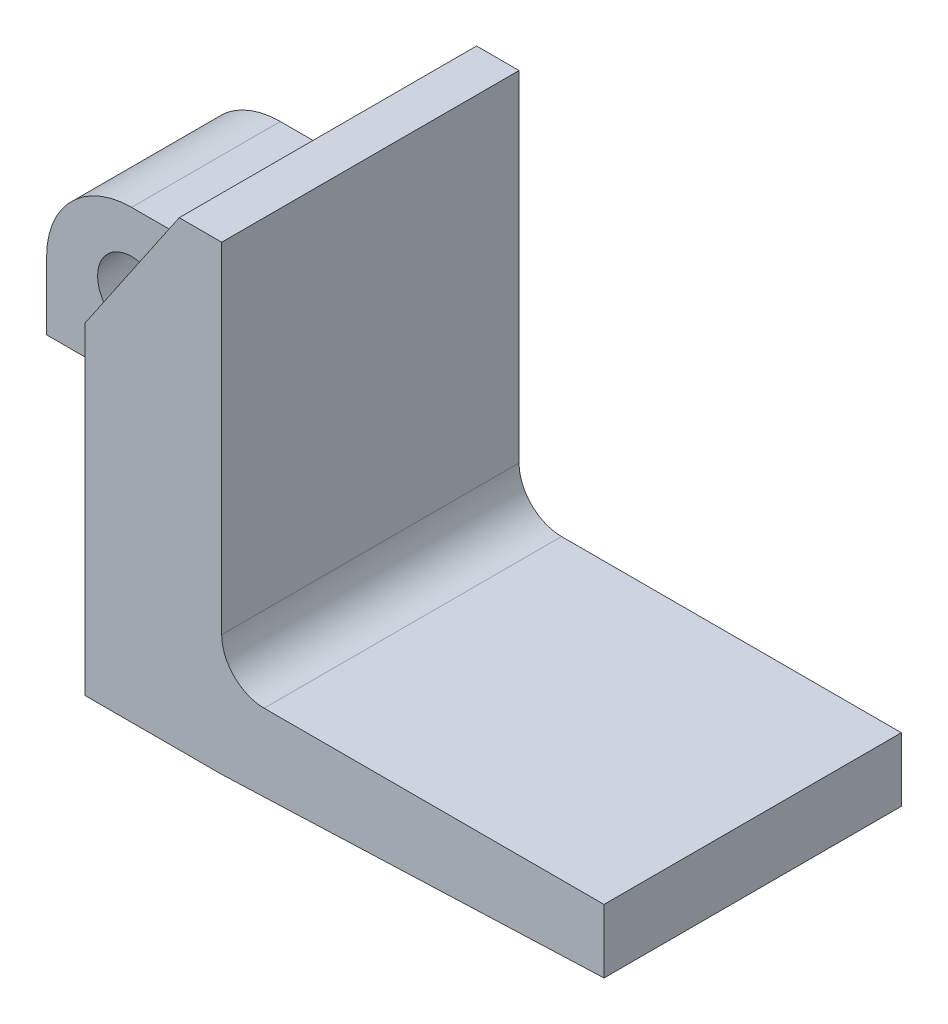
ISO-10303-21;
HEADER;
FILE_DESCRIPTION(('STEP AP214'),'2;1');
FILE_NAME('part.step','',(''),(''),'','','');
FILE_SCHEMA(('AUTOMOTIVE_DESIGN { 1 0 10303 214 1 1 1 1 }'));
ENDSEC;
DATA;
#1=APPLICATION_CONTEXT('core data for automotive mechanical design processes');
#2=APPLICATION_PROTOCOL_DEFINITION('international standard','automotive_design',2000,#1);
#3=PRODUCT_CONTEXT('',#1,'mechanical');
#4=PRODUCT('Part','Part','',(#3));
#5=PRODUCT_RELATED_PRODUCT_CATEGORY('part','',(#4));
#6=PRODUCT_DEFINITION_FORMATION('','',#4);
#7=PRODUCT_DEFINITION_CONTEXT('part definition',#1,'design');
#8=PRODUCT_DEFINITION('design','',#6,#7);
#9=PRODUCT_DEFINITION_SHAPE('','',#8);
#10=(LENGTH_UNIT() NAMED_UNIT(*) SI_UNIT(.MILLI.,.METRE.));
#11=(NAMED_UNIT(*) PLANE_ANGLE_UNIT() SI_UNIT($,.RADIAN.));
#12=(NAMED_UNIT(*) SI_UNIT($,.STERADIAN.) SOLID_ANGLE_UNIT());
#13=UNCERTAINTY_MEASURE_WITH_UNIT(LENGTH_MEASURE(1.E-05),#10,'distance_accuracy_value','');
#14=(GEOMETRIC_REPRESENTATION_CONTEXT(3) GLOBAL_UNCERTAINTY_ASSIGNED_CONTEXT((#13)) GLOBAL_UNIT_ASSIGNED_CONTEXT((#10,
#11,#12)) REPRESENTATION_CONTEXT('',''));
#15=CARTESIAN_POINT('',(0.,0.,0.));
#16=DIRECTION('',(0.,0.,1.));
#17=DIRECTION('',(1.,0.,0.));
#18=AXIS2_PLACEMENT_3D('',#15,#16,#17);
#19=CARTESIAN_POINT('',(-35.6902,32.7054976,44.45));
#20=DIRECTION('',(0.,-1.,0.));
#21=DIRECTION('',(1.,0.,0.));
#22=AXIS2_PLACEMENT_3D('',#19,#20,#21);
#23=PLANE('',#22);
#24=DIRECTION('',(-1.,0.,0.));
#25=VECTOR('',#24,1.);
#26=CARTESIAN_POINT('',(-22.9902,32.7054976,22.225));
#27=LINE('',#26,#25);
#28=CARTESIAN_POINT('',(-24.333799736365,32.7054976,22.225));
#29=VERTEX_POINT('',#28);
#30=CARTESIAN_POINT('',(-35.6902,32.7054976,22.225));
#31=VERTEX_POINT('',#30);
#32=EDGE_CURVE('E213',#29,#31,#27,.T.);
#33=ORIENTED_EDGE('',*,*,#32,.F.);
#34=DIRECTION('',(0.,0.,-1.));
#35=VECTOR('',#34,1.);
#36=CARTESIAN_POINT('',(-24.333799736365,32.7054976,0.));
#37=LINE('',#36,#35);
#38=CARTESIAN_POINT('',(-24.333799736365,32.7054976,0.));
#39=VERTEX_POINT('',#38);
#40=EDGE_CURVE('E204',#29,#39,#37,.T.);
#41=ORIENTED_EDGE('',*,*,#40,.T.);
#42=DIRECTION('',(-1.,0.,0.));
#43=VECTOR('',#42,1.);
#44=CARTESIAN_POINT('',(-35.6902,32.7054976,0.));
#45=LINE('',#44,#43);
#46=CARTESIAN_POINT('',(-35.6902,32.7054976,0.));
#47=VERTEX_POINT('',#46);
#48=EDGE_CURVE('E212',#39,#47,#45,.T.);
#49=ORIENTED_EDGE('',*,*,#48,.T.);
#50=DIRECTION('',(0.,0.,-1.));
#51=VECTOR('',#50,1.);
#52=CARTESIAN_POINT('',(-35.6902,32.7054976,44.45));
#53=LINE('',#52,#51);
#54=EDGE_CURVE('E181',#31,#47,#53,.T.);
#55=ORIENTED_EDGE('',*,*,#54,.F.);
#56=EDGE_LOOP('',(#33,#41,#49,#55));
#57=FACE_BOUND('',#56,.T.);
#58=ADVANCED_FACE('F47',(#57),#23,.F.);
#59=CARTESIAN_POINT('',(-35.6902,20.0054976,44.45));
#60=DIRECTION('',(0.,0.,-1.));
#61=DIRECTION('',(-1.,0.,0.));
#62=AXIS2_PLACEMENT_3D('',#59,#60,#61);
#63=CYLINDRICAL_SURFACE('',#62,12.7);
#64=CARTESIAN_POINT('',(-35.6902,20.0054976,22.225));
#65=DIRECTION('',(0.,0.,1.));
#66=DIRECTION('',(1.,0.,0.));
#67=AXIS2_PLACEMENT_3D('',#64,#65,#66);
#68=CIRCLE('',#67,12.7);
#69=CARTESIAN_POINT('',(-48.3902,20.0054976,22.225));
#70=VERTEX_POINT('',#69);
#71=EDGE_CURVE('E162',#31,#70,#68,.T.);
#72=ORIENTED_EDGE('',*,*,#71,.F.);
#73=ORIENTED_EDGE('',*,*,#54,.T.);
#74=CARTESIAN_POINT('',(-35.6902,20.0054976,0.));
#75=DIRECTION('',(0.,0.,1.));
#76=DIRECTION('',(1.,0.,0.));
#77=AXIS2_PLACEMENT_3D('',#74,#75,#76);
#78=CIRCLE('',#77,12.7);
#79=CARTESIAN_POINT('',(-48.3902,20.0054976,0.));
#80=VERTEX_POINT('',#79);
#81=EDGE_CURVE('E220',#47,#80,#78,.T.);
#82=ORIENTED_EDGE('',*,*,#81,.T.);
#83=DIRECTION('',(0.,0.,-1.));
#84=VECTOR('',#83,1.);
#85=CARTESIAN_POINT('',(-48.3902,20.0054976,44.45));
#86=LINE('',#85,#84);
#87=EDGE_CURVE('E179',#70,#80,#86,.T.);
#88=ORIENTED_EDGE('',*,*,#87,.F.);
#89=EDGE_LOOP('',(#72,#73,#82,#88));
#90=FACE_BOUND('',#89,.T.);
#91=ADVANCED_FACE('F333',(#90),#63,.T.);
#92=CARTESIAN_POINT('',(-48.3902,9.8454976,44.45));
#93=DIRECTION('',(1.,0.,0.));
#94=DIRECTION('',(0.,1.,0.));
#95=AXIS2_PLACEMENT_3D('',#92,#93,#94);
#96=PLANE('',#95);
#97=DIRECTION('',(0.,-1.,0.));
#98=VECTOR('',#97,1.);
#99=CARTESIAN_POINT('',(-48.3902,20.0054976,22.225));
#100=LINE('',#99,#98);
#101=CARTESIAN_POINT('',(-48.3902,9.8454976,22.225));
#102=VERTEX_POINT('',#101);
#103=EDGE_CURVE('E155',#70,#102,#100,.T.);
#104=ORIENTED_EDGE('',*,*,#103,.F.);
#105=ORIENTED_EDGE('',*,*,#87,.T.);
#106=DIRECTION('',(0.,-1.,0.));
#107=VECTOR('',#106,1.);
#108=CARTESIAN_POINT('',(-48.3902,9.8454976,0.));
#109=LINE('',#108,#107);
#110=CARTESIAN_POINT('',(-48.3902,9.8454976,0.));
#111=VERTEX_POINT('',#110);
#112=EDGE_CURVE('E177',#80,#111,#109,.T.);
#113=ORIENTED_EDGE('',*,*,#112,.T.);
#114=DIRECTION('',(0.,0.,-1.));
#115=VECTOR('',#114,1.);
#116=CARTESIAN_POINT('',(-48.3902,9.8454976,44.45));
#117=LINE('',#116,#115);
#118=EDGE_CURVE('E170',#102,#111,#117,.T.);
#119=ORIENTED_EDGE('',*,*,#118,.F.);
#120=EDGE_LOOP('',(#104,#105,#113,#119));
#121=FACE_BOUND('',#120,.T.);
#122=ADVANCED_FACE('F175',(#121),#96,.F.);
#123=CARTESIAN_POINT('',(-20.4502,9.84549760000001,44.45));
#124=DIRECTION('',(0.,1.,0.));
#125=DIRECTION('',(-1.,0.,0.));
#126=AXIS2_PLACEMENT_3D('',#123,#124,#125);
#127=PLANE('',#126);
#128=DIRECTION('',(1.,0.,0.));
#129=VECTOR('',#128,1.);
#130=CARTESIAN_POINT('',(-48.3902,9.8454976,22.225));
#131=LINE('',#130,#129);
#132=CARTESIAN_POINT('',(-20.4502,9.84549760000001,22.225));
#133=VERTEX_POINT('',#132);
#134=EDGE_CURVE('E159',#102,#133,#131,.T.);
#135=ORIENTED_EDGE('',*,*,#134,.F.);
#136=ORIENTED_EDGE('',*,*,#118,.T.);
#137=DIRECTION('',(1.,0.,0.));
#138=VECTOR('',#137,1.);
#139=CARTESIAN_POINT('',(-20.4502,9.84549760000001,0.));
#140=LINE('',#139,#138);
#141=CARTESIAN_POINT('',(-20.4502,9.84549760000001,0.));
#142=VERTEX_POINT('',#141);
#143=EDGE_CURVE('E229',#111,#142,#140,.T.);
#144=ORIENTED_EDGE('',*,*,#143,.T.);
#145=DIRECTION('',(0.,0.,-1.));
#146=VECTOR('',#145,1.);
#147=CARTESIAN_POINT('',(-20.4502,9.84549760000001,44.45));
#148=LINE('',#147,#146);
#149=EDGE_CURVE('E172',#133,#142,#148,.T.);
#150=ORIENTED_EDGE('',*,*,#149,.F.);
#151=EDGE_LOOP('',(#135,#136,#144,#150));
#152=FACE_BOUND('',#151,.T.);
#153=ADVANCED_FACE('F168',(#152),#127,.F.);
#154=CARTESIAN_POINT('',(0.,57.15,44.45));
#155=DIRECTION('',(-1.,0.,0.));
#156=DIRECTION('',(0.,-1.,0.));
#157=AXIS2_PLACEMENT_3D('',#154,#155,#156);
#158=PLANE('',#157);
#159=DIRECTION('',(0.,1.,0.));
#160=VECTOR('',#159,1.);
#161=CARTESIAN_POINT('',(0.,57.15,44.45));
#162=LINE('',#161,#160);
#163=CARTESIAN_POINT('',(0.,6.35,44.45));
#164=VERTEX_POINT('',#163);
#165=CARTESIAN_POINT('',(0.,57.15,44.45));
#166=VERTEX_POINT('',#165);
#167=EDGE_CURVE('E242',#164,#166,#162,.T.);
#168=ORIENTED_EDGE('',*,*,#167,.F.);
#169=DIRECTION('',(0.,0.,-1.));
#170=VECTOR('',#169,1.);
#171=CARTESIAN_POINT('',(0.,6.35,0.));
#172=LINE('',#171,#170);
#173=CARTESIAN_POINT('',(0.,6.35,0.));
#174=VERTEX_POINT('',#173);
#175=EDGE_CURVE('E195',#164,#174,#172,.T.);
#176=ORIENTED_EDGE('',*,*,#175,.T.);
#177=DIRECTION('',(0.,1.,0.));
#178=VECTOR('',#177,1.);
#179=CARTESIAN_POINT('',(0.,57.15,0.));
#180=LINE('',#179,#178);
#181=CARTESIAN_POINT('',(0.,57.15,0.));
#182=VERTEX_POINT('',#181);
#183=EDGE_CURVE('E283',#174,#182,#180,.T.);
#184=ORIENTED_EDGE('',*,*,#183,.T.);
#185=DIRECTION('',(0.,0.,-1.));
#186=VECTOR('',#185,1.);
#187=CARTESIAN_POINT('',(0.,57.15,44.45));
#188=LINE('',#187,#186);
#189=EDGE_CURVE('E192',#166,#182,#188,.T.);
#190=ORIENTED_EDGE('',*,*,#189,.F.);
#191=EDGE_LOOP('',(#168,#176,#184,#190));
#192=FACE_BOUND('',#191,.T.);
#193=ADVANCED_FACE('F314',(#192),#158,.F.);
#194=CARTESIAN_POINT('',(-6.35,57.15,44.45));
#195=DIRECTION('',(0.,-1.,0.));
#196=DIRECTION('',(0.,0.,-1.));
#197=AXIS2_PLACEMENT_3D('',#194,#195,#196);
#198=PLANE('',#197);
#199=DIRECTION('',(-1.,0.,0.));
#200=VECTOR('',#199,1.);
#201=CARTESIAN_POINT('',(-6.35,57.15,0.));
#202=LINE('',#201,#200);
#203=CARTESIAN_POINT('',(-6.35,57.15,0.));
#204=VERTEX_POINT('',#203);
#205=EDGE_CURVE('E224',#182,#204,#202,.T.);
#206=ORIENTED_EDGE('',*,*,#205,.T.);
#207=DIRECTION('',(0.,0.,-1.));
#208=VECTOR('',#207,1.);
#209=CARTESIAN_POINT('',(-6.35,57.15,44.45));
#210=LINE('',#209,#208);
#211=CARTESIAN_POINT('',(-6.35,57.15,44.45));
#212=VERTEX_POINT('',#211);
#213=EDGE_CURVE('E189',#212,#204,#210,.T.);
#214=ORIENTED_EDGE('',*,*,#213,.F.);
#215=DIRECTION('',(-1.,0.,0.));
#216=VECTOR('',#215,1.);
#217=CARTESIAN_POINT('',(-6.35,57.15,44.45));
#218=LINE('',#217,#216);
#219=EDGE_CURVE('E297',#166,#212,#218,.T.);
#220=ORIENTED_EDGE('',*,*,#219,.F.);
#221=ORIENTED_EDGE('',*,*,#189,.T.);
#222=EDGE_LOOP('',(#206,#214,#220,#221));
#223=FACE_BOUND('',#222,.T.);
#224=ADVANCED_FACE('F288',(#223),#198,.F.);
#225=CARTESIAN_POINT('',(-22.9902,32.7054976,44.45));
#226=DIRECTION('',(0.826644323966202,-0.56272476545329,0.));
#227=DIRECTION('',(0.56272476545329,0.826644323966202,0.));
#228=AXIS2_PLACEMENT_3D('',#225,#226,#227);
#229=PLANE('',#228);
#230=DIRECTION('',(-0.56272476545329,-0.826644323966202,0.));
#231=VECTOR('',#230,1.);
#232=CARTESIAN_POINT('',(-22.9902,32.7054976,0.));
#233=LINE('',#232,#231);
#234=CARTESIAN_POINT('',(-22.2341231534909,33.8161766957486,0.));
#235=VERTEX_POINT('',#234);
#236=EDGE_CURVE('E221',#204,#235,#233,.T.);
#237=ORIENTED_EDGE('',*,*,#236,.T.);
#238=DIRECTION('',(0.,0.,-1.));
#239=VECTOR('',#238,1.);
#240=CARTESIAN_POINT('',(-22.2341231534909,33.8161766957486,22.225));
#241=LINE('',#240,#239);
#242=CARTESIAN_POINT('',(-22.2341231534909,33.8161766957486,22.225));
#243=VERTEX_POINT('',#242);
#244=EDGE_CURVE('E69',#235,#243,#241,.F.);
#245=ORIENTED_EDGE('',*,*,#244,.T.);
#246=DIRECTION('',(-0.562724765453292,-0.826644323966201,0.));
#247=VECTOR('',#246,1.);
#248=CARTESIAN_POINT('',(-20.4502,36.4367650184204,22.225));
#249=LINE('',#248,#247);
#250=CARTESIAN_POINT('',(-20.4502,36.4367650184204,22.225));
#251=VERTEX_POINT('',#250);
#252=EDGE_CURVE('E305',#251,#243,#249,.T.);
#253=ORIENTED_EDGE('',*,*,#252,.F.);
#254=DIRECTION('',(0.,0.,1.));
#255=VECTOR('',#254,1.);
#256=CARTESIAN_POINT('',(-20.4502,36.4367650184204,22.225));
#257=LINE('',#256,#255);
#258=CARTESIAN_POINT('',(-20.4502,36.4367650184204,44.45));
#259=VERTEX_POINT('',#258);
#260=EDGE_CURVE('E284',#251,#259,#257,.T.);
#261=ORIENTED_EDGE('',*,*,#260,.T.);
#262=DIRECTION('',(-0.56272476545329,-0.826644323966202,0.));
#263=VECTOR('',#262,1.);
#264=CARTESIAN_POINT('',(-22.9902,32.7054976,44.45));
#265=LINE('',#264,#263);
#266=EDGE_CURVE('E295',#212,#259,#265,.T.);
#267=ORIENTED_EDGE('',*,*,#266,.F.);
#268=ORIENTED_EDGE('',*,*,#213,.T.);
#269=EDGE_LOOP('',(#237,#245,#253,#261,#267,#268));
#270=FACE_BOUND('',#269,.T.);
#271=ADVANCED_FACE('F292',(#270),#229,.F.);
#272=CARTESIAN_POINT('',(-20.4502,9.84549760000001,44.45));
#273=DIRECTION('',(1.,0.,0.));
#274=DIRECTION('',(0.,1.,0.));
#275=AXIS2_PLACEMENT_3D('',#272,#273,#274);
#276=PLANE('',#275);
#277=DIRECTION('',(0.,-1.,0.));
#278=VECTOR('',#277,1.);
#279=CARTESIAN_POINT('',(-20.4502,9.84549760000001,0.));
#280=LINE('',#279,#278);
#281=CARTESIAN_POINT('',(-20.4502,-11.7445024,0.));
#282=VERTEX_POINT('',#281);
#283=EDGE_CURVE('E231',#142,#282,#280,.T.);
#284=ORIENTED_EDGE('',*,*,#283,.T.);
#285=DIRECTION('',(0.,0.,-1.));
#286=VECTOR('',#285,1.);
#287=CARTESIAN_POINT('',(-20.4502,-11.7445024,44.45));
#288=LINE('',#287,#286);
#289=CARTESIAN_POINT('',(-20.4502,-11.7445024,44.45));
#290=VERTEX_POINT('',#289);
#291=EDGE_CURVE('E183',#290,#282,#288,.T.);
#292=ORIENTED_EDGE('',*,*,#291,.F.);
#293=DIRECTION('',(0.,-1.,0.));
#294=VECTOR('',#293,1.);
#295=CARTESIAN_POINT('',(-20.4502,9.84549760000001,44.45));
#296=LINE('',#295,#294);
#297=EDGE_CURVE('E296',#259,#290,#296,.T.);
#298=ORIENTED_EDGE('',*,*,#297,.F.);
#299=ORIENTED_EDGE('',*,*,#260,.F.);
#300=DIRECTION('',(0.,1.,0.));
#301=VECTOR('',#300,1.);
#302=CARTESIAN_POINT('',(-20.4502,9.84549760000001,22.225));
#303=LINE('',#302,#301);
#304=EDGE_CURVE('E173',#133,#251,#303,.T.);
#305=ORIENTED_EDGE('',*,*,#304,.F.);
#306=ORIENTED_EDGE('',*,*,#149,.T.);
#307=EDGE_LOOP('',(#284,#292,#298,#299,#305,#306));
#308=FACE_BOUND('',#307,.T.);
#309=ADVANCED_FACE('F303',(#308),#276,.F.);
#310=CARTESIAN_POINT('',(-20.4502,-11.7445024,44.45));
#311=DIRECTION('',(0.,1.,0.));
#312=DIRECTION('',(-1.,0.,0.));
#313=AXIS2_PLACEMENT_3D('',#310,#311,#312);
#314=PLANE('',#313);
#315=DIRECTION('',(1.,0.,0.));
#316=VECTOR('',#315,1.);
#317=CARTESIAN_POINT('',(-20.4502,-11.7445024,0.));
#318=LINE('',#317,#316);
#319=CARTESIAN_POINT('',(0.,-11.7445024,0.));
#320=VERTEX_POINT('',#319);
#321=EDGE_CURVE('E233',#282,#320,#318,.T.);
#322=ORIENTED_EDGE('',*,*,#321,.T.);
#323=DIRECTION('',(0.,0.,-1.));
#324=VECTOR('',#323,1.);
#325=CARTESIAN_POINT('',(0.,-11.7445024,44.45));
#326=LINE('',#325,#324);
#327=CARTESIAN_POINT('',(0.,-11.7445024,44.45));
#328=VERTEX_POINT('',#327);
#329=EDGE_CURVE('E250',#328,#320,#326,.T.);
#330=ORIENTED_EDGE('',*,*,#329,.F.);
#331=DIRECTION('',(1.,0.,0.));
#332=VECTOR('',#331,1.);
#333=CARTESIAN_POINT('',(-20.4502,-11.7445024,44.45));
#334=LINE('',#333,#332);
#335=EDGE_CURVE('E259',#290,#328,#334,.T.);
#336=ORIENTED_EDGE('',*,*,#335,.F.);
#337=ORIENTED_EDGE('',*,*,#291,.T.);
#338=EDGE_LOOP('',(#322,#330,#336,#337));
#339=FACE_BOUND('',#338,.T.);
#340=ADVANCED_FACE('F257',(#339),#314,.F.);
#341=CARTESIAN_POINT('',(0.,-11.7445024,44.45));
#342=DIRECTION('',(-0.0388071826393708,0.999246717570588,0.));
#343=DIRECTION('',(-0.999246717570588,-0.0388071826393708,0.));
#344=AXIS2_PLACEMENT_3D('',#341,#342,#343);
#345=PLANE('',#344);
#346=DIRECTION('',(0.999246717570588,0.0388071826393708,0.));
#347=VECTOR('',#346,1.);
#348=CARTESIAN_POINT('',(0.,-11.7445024,0.));
#349=LINE('',#348,#347);
#350=CARTESIAN_POINT('',(57.15,-9.525,0.));
#351=VERTEX_POINT('',#350);
#352=EDGE_CURVE('E235',#320,#351,#349,.T.);
#353=ORIENTED_EDGE('',*,*,#352,.T.);
#354=DIRECTION('',(0.,0.,-1.));
#355=VECTOR('',#354,1.);
#356=CARTESIAN_POINT('',(57.15,-9.525,44.45));
#357=LINE('',#356,#355);
#358=CARTESIAN_POINT('',(57.15,-9.525,44.45));
#359=VERTEX_POINT('',#358);
#360=EDGE_CURVE('E246',#359,#351,#357,.T.);
#361=ORIENTED_EDGE('',*,*,#360,.F.);
#362=DIRECTION('',(0.999246717570588,0.0388071826393708,0.));
#363=VECTOR('',#362,1.);
#364=CARTESIAN_POINT('',(0.,-11.7445024,44.45));
#365=LINE('',#364,#363);
#366=EDGE_CURVE('E277',#328,#359,#365,.T.);
#367=ORIENTED_EDGE('',*,*,#366,.F.);
#368=ORIENTED_EDGE('',*,*,#329,.T.);
#369=EDGE_LOOP('',(#353,#361,#367,#368));
#370=FACE_BOUND('',#369,.T.);
#371=ADVANCED_FACE('F267',(#370),#345,.F.);
#372=CARTESIAN_POINT('',(57.15,0.,44.45));
#373=DIRECTION('',(-1.,0.,0.));
#374=DIRECTION('',(0.,-1.,0.));
#375=AXIS2_PLACEMENT_3D('',#372,#373,#374);
#376=PLANE('',#375);
#377=DIRECTION('',(0.,1.,0.));
#378=VECTOR('',#377,1.);
#379=CARTESIAN_POINT('',(57.15,0.,0.));
#380=LINE('',#379,#378);
#381=CARTESIAN_POINT('',(57.15,0.,0.));
#382=VERTEX_POINT('',#381);
#383=EDGE_CURVE('E237',#351,#382,#380,.T.);
#384=ORIENTED_EDGE('',*,*,#383,.T.);
#385=DIRECTION('',(0.,0.,-1.));
#386=VECTOR('',#385,1.);
#387=CARTESIAN_POINT('',(57.15,0.,44.45));
#388=LINE('',#387,#386);
#389=CARTESIAN_POINT('',(57.15,0.,44.45));
#390=VERTEX_POINT('',#389);
#391=EDGE_CURVE('E243',#390,#382,#388,.T.);
#392=ORIENTED_EDGE('',*,*,#391,.F.);
#393=DIRECTION('',(0.,1.,0.));
#394=VECTOR('',#393,1.);
#395=CARTESIAN_POINT('',(57.15,0.,44.45));
#396=LINE('',#395,#394);
#397=EDGE_CURVE('E273',#359,#390,#396,.T.);
#398=ORIENTED_EDGE('',*,*,#397,.F.);
#399=ORIENTED_EDGE('',*,*,#360,.T.);
#400=EDGE_LOOP('',(#384,#392,#398,#399));
#401=FACE_BOUND('',#400,.T.);
#402=ADVANCED_FACE('F271',(#401),#376,.F.);
#403=CARTESIAN_POINT('',(0.,0.,44.45));
#404=DIRECTION('',(0.,-1.,0.));
#405=DIRECTION('',(0.,0.,-1.));
#406=AXIS2_PLACEMENT_3D('',#403,#404,#405);
#407=PLANE('',#406);
#408=DIRECTION('',(-1.,0.,0.));
#409=VECTOR('',#408,1.);
#410=CARTESIAN_POINT('',(0.,0.,0.));
#411=LINE('',#410,#409);
#412=CARTESIAN_POINT('',(6.35,0.,0.));
#413=VERTEX_POINT('',#412);
#414=EDGE_CURVE('E239',#382,#413,#411,.T.);
#415=ORIENTED_EDGE('',*,*,#414,.T.);
#416=DIRECTION('',(0.,0.,-1.));
#417=VECTOR('',#416,1.);
#418=CARTESIAN_POINT('',(6.35,0.,44.45));
#419=LINE('',#418,#417);
#420=CARTESIAN_POINT('',(6.35,0.,44.45));
#421=VERTEX_POINT('',#420);
#422=EDGE_CURVE('E198',#413,#421,#419,.F.);
#423=ORIENTED_EDGE('',*,*,#422,.T.);
#424=DIRECTION('',(-1.,0.,0.));
#425=VECTOR('',#424,1.);
#426=CARTESIAN_POINT('',(0.,0.,44.45));
#427=LINE('',#426,#425);
#428=EDGE_CURVE('E247',#390,#421,#427,.T.);
#429=ORIENTED_EDGE('',*,*,#428,.F.);
#430=ORIENTED_EDGE('',*,*,#391,.T.);
#431=EDGE_LOOP('',(#415,#423,#429,#430));
#432=FACE_BOUND('',#431,.T.);
#433=ADVANCED_FACE('F318',(#432),#407,.F.);
#434=CARTESIAN_POINT('',(-35.6902,20.0054976,44.45));
#435=DIRECTION('',(0.,0.,1.));
#436=DIRECTION('',(1.,0.,0.));
#437=AXIS2_PLACEMENT_3D('',#434,#435,#436);
#438=PLANE('',#437);
#439=ORIENTED_EDGE('',*,*,#266,.T.);
#440=ORIENTED_EDGE('',*,*,#297,.T.);
#441=ORIENTED_EDGE('',*,*,#335,.T.);
#442=ORIENTED_EDGE('',*,*,#366,.T.);
#443=ORIENTED_EDGE('',*,*,#397,.T.);
#444=ORIENTED_EDGE('',*,*,#428,.T.);
#445=CARTESIAN_POINT('',(6.35,6.35,44.45));
#446=DIRECTION('',(0.,0.,1.));
#447=DIRECTION('',(1.,0.,0.));
#448=AXIS2_PLACEMENT_3D('',#445,#446,#447);
#449=CIRCLE('',#448,6.35);
#450=EDGE_CURVE('E202',#421,#164,#449,.F.);
#451=ORIENTED_EDGE('',*,*,#450,.T.);
#452=ORIENTED_EDGE('',*,*,#167,.T.);
#453=ORIENTED_EDGE('',*,*,#219,.T.);
#454=EDGE_LOOP('',(#439,#440,#441,#442,#443,#444,#451,#452,#453));
#455=FACE_BOUND('',#454,.T.);
#456=ADVANCED_FACE('F302',(#455),#438,.T.);
#457=CARTESIAN_POINT('',(-35.6902,20.0054976,0.));
#458=DIRECTION('',(0.,0.,1.));
#459=DIRECTION('',(1.,0.,0.));
#460=AXIS2_PLACEMENT_3D('',#457,#458,#459);
#461=PLANE('',#460);
#462=CARTESIAN_POINT('',(-35.6902,21.2754976,0.));
#463=DIRECTION('',(0.,0.,-1.));
#464=DIRECTION('',(-1.,0.,0.));
#465=AXIS2_PLACEMENT_3D('',#462,#463,#464);
#466=CIRCLE('',#465,5.07999999999999);
#467=CARTESIAN_POINT('',(-40.7702,21.2754976,0.));
#468=VERTEX_POINT('',#467);
#469=EDGE_CURVE('E375',#468,#468,#466,.T.);
#470=ORIENTED_EDGE('',*,*,#469,.F.);
#471=EDGE_LOOP('',(#470));
#472=FACE_BOUND('',#471,.T.);
#473=ORIENTED_EDGE('',*,*,#183,.F.);
#474=CARTESIAN_POINT('',(6.35,6.35,0.));
#475=DIRECTION('',(0.,0.,1.));
#476=DIRECTION('',(1.,0.,0.));
#477=AXIS2_PLACEMENT_3D('',#474,#475,#476);
#478=CIRCLE('',#477,6.35);
#479=EDGE_CURVE('E200',#174,#413,#478,.T.);
#480=ORIENTED_EDGE('',*,*,#479,.T.);
#481=ORIENTED_EDGE('',*,*,#414,.F.);
#482=ORIENTED_EDGE('',*,*,#383,.F.);
#483=ORIENTED_EDGE('',*,*,#352,.F.);
#484=ORIENTED_EDGE('',*,*,#321,.F.);
#485=ORIENTED_EDGE('',*,*,#283,.F.);
#486=ORIENTED_EDGE('',*,*,#143,.F.);
#487=ORIENTED_EDGE('',*,*,#112,.F.);
#488=ORIENTED_EDGE('',*,*,#81,.F.);
#489=ORIENTED_EDGE('',*,*,#48,.F.);
#490=CARTESIAN_POINT('',(-24.333799736365,35.2454976,0.));
#491=DIRECTION('',(0.,0.,1.));
#492=DIRECTION('',(1.,0.,0.));
#493=AXIS2_PLACEMENT_3D('',#490,#491,#492);
#494=CIRCLE('',#493,2.54);
#495=EDGE_CURVE('E56',#39,#235,#494,.T.);
#496=ORIENTED_EDGE('',*,*,#495,.T.);
#497=ORIENTED_EDGE('',*,*,#236,.F.);
#498=ORIENTED_EDGE('',*,*,#205,.F.);
#499=EDGE_LOOP('',(#473,#480,#481,#482,#483,#484,#485,#486,#487,#488,#489,#496,#497,#498));
#500=FACE_BOUND('',#499,.T.);
#501=ADVANCED_FACE('F218',(#472,#500),#461,.F.);
#502=CARTESIAN_POINT('',(6.35,6.35,44.45));
#503=DIRECTION('',(0.,0.,1.));
#504=DIRECTION('',(1.,0.,0.));
#505=AXIS2_PLACEMENT_3D('',#502,#503,#504);
#506=CYLINDRICAL_SURFACE('',#505,6.35);
#507=ORIENTED_EDGE('',*,*,#450,.F.);
#508=ORIENTED_EDGE('',*,*,#422,.F.);
#509=ORIENTED_EDGE('',*,*,#479,.F.);
#510=ORIENTED_EDGE('',*,*,#175,.F.);
#511=EDGE_LOOP('',(#507,#508,#509,#510));
#512=FACE_BOUND('',#511,.T.);
#513=ADVANCED_FACE('F319',(#512),#506,.F.);
#514=CARTESIAN_POINT('',(-35.6902,20.0054976,22.225));
#515=DIRECTION('',(0.,0.,1.));
#516=DIRECTION('',(1.,0.,0.));
#517=AXIS2_PLACEMENT_3D('',#514,#515,#516);
#518=PLANE('',#517);
#519=CARTESIAN_POINT('',(-35.6902,21.2754976,22.225));
#520=DIRECTION('',(0.,0.,1.));
#521=DIRECTION('',(1.,0.,0.));
#522=AXIS2_PLACEMENT_3D('',#519,#520,#521);
#523=CIRCLE('',#522,5.07999999999999);
#524=CARTESIAN_POINT('',(-30.6102,21.2754976,22.225));
#525=VERTEX_POINT('',#524);
#526=EDGE_CURVE('E51',#525,#525,#523,.T.);
#527=ORIENTED_EDGE('',*,*,#526,.F.);
#528=EDGE_LOOP('',(#527));
#529=FACE_BOUND('',#528,.T.);
#530=ORIENTED_EDGE('',*,*,#103,.T.);
#531=ORIENTED_EDGE('',*,*,#134,.T.);
#532=ORIENTED_EDGE('',*,*,#304,.T.);
#533=ORIENTED_EDGE('',*,*,#252,.T.);
#534=CARTESIAN_POINT('',(-24.333799736365,35.2454976,22.225));
#535=DIRECTION('',(0.,0.,1.));
#536=DIRECTION('',(1.,0.,0.));
#537=AXIS2_PLACEMENT_3D('',#534,#535,#536);
#538=CIRCLE('',#537,2.54);
#539=EDGE_CURVE('E11',#243,#29,#538,.F.);
#540=ORIENTED_EDGE('',*,*,#539,.T.);
#541=ORIENTED_EDGE('',*,*,#32,.T.);
#542=ORIENTED_EDGE('',*,*,#71,.T.);
#543=EDGE_LOOP('',(#530,#531,#532,#533,#540,#541,#542));
#544=FACE_BOUND('',#543,.T.);
#545=ADVANCED_FACE('F157',(#529,#544),#518,.T.);
#546=CARTESIAN_POINT('',(-24.333799736365,35.2454976,44.45));
#547=DIRECTION('',(0.,0.,1.));
#548=DIRECTION('',(1.,0.,0.));
#549=AXIS2_PLACEMENT_3D('',#546,#547,#548);
#550=CYLINDRICAL_SURFACE('',#549,2.54);
#551=ORIENTED_EDGE('',*,*,#539,.F.);
#552=ORIENTED_EDGE('',*,*,#244,.F.);
#553=ORIENTED_EDGE('',*,*,#495,.F.);
#554=ORIENTED_EDGE('',*,*,#40,.F.);
#555=EDGE_LOOP('',(#551,#552,#553,#554));
#556=FACE_BOUND('',#555,.T.);
#557=ADVANCED_FACE('F49',(#556),#550,.F.);
#558=CARTESIAN_POINT('',(-35.6902,21.2754976,0.));
#559=DIRECTION('',(0.,0.,-1.));
#560=DIRECTION('',(-1.,0.,0.));
#561=AXIS2_PLACEMENT_3D('',#558,#559,#560);
#562=CYLINDRICAL_SURFACE('',#561,5.07999999999999);
#563=ORIENTED_EDGE('',*,*,#526,.T.);
#564=EDGE_LOOP('',(#563));
#565=FACE_BOUND('',#564,.T.);
#566=ORIENTED_EDGE('',*,*,#469,.T.);
#567=EDGE_LOOP('',(#566));
#568=FACE_BOUND('',#567,.T.);
#569=ADVANCED_FACE('F364',(#565,#568),#562,.F.);
#570=CLOSED_SHELL('',(#58,#91,#122,#153,#193,#224,#271,#309,#340,#371,#402,#433,#456,#501,#513,
#545,#557,#569));
#571=MANIFOLD_SOLID_BREP('B2',#570);
#572=ADVANCED_BREP_SHAPE_REPRESENTATION('',(#18,#571),#14);
#573=SHAPE_DEFINITION_REPRESENTATION(#9,#572);
ENDSEC;
END-ISO-10303-21;
